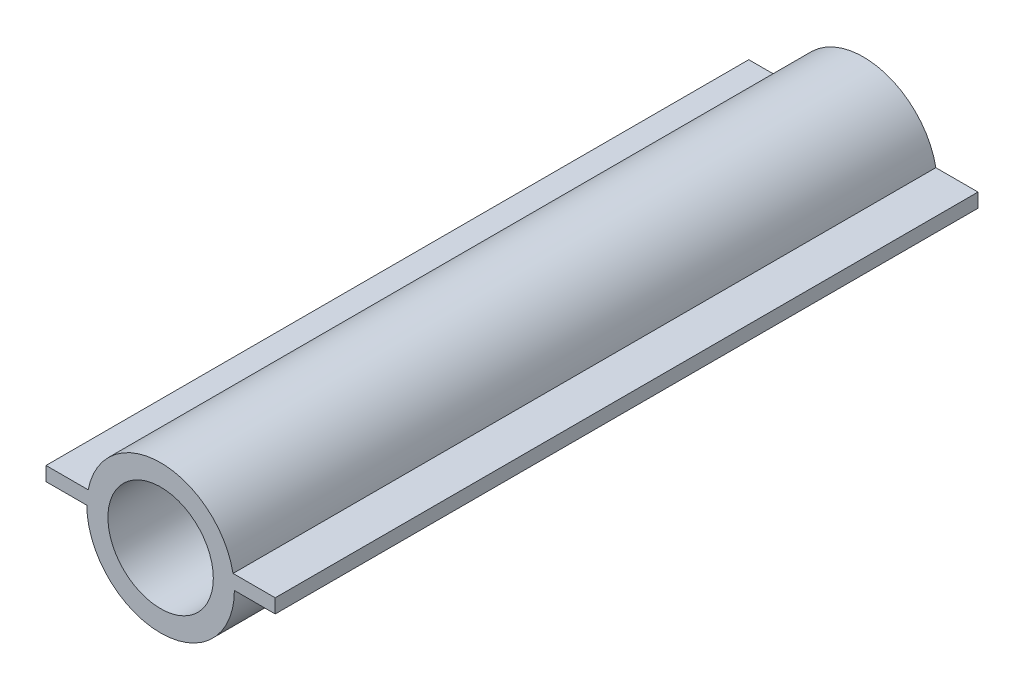
ISO-10303-21;
HEADER;
FILE_DESCRIPTION(('STEP AP214'),'2;1');
FILE_NAME('part.step','',(''),(''),'','','');
FILE_SCHEMA(('AUTOMOTIVE_DESIGN { 1 0 10303 214 1 1 1 1 }'));
ENDSEC;
DATA;
#1=APPLICATION_CONTEXT('core data for automotive mechanical design processes');
#2=APPLICATION_PROTOCOL_DEFINITION('international standard','automotive_design',2000,#1);
#3=PRODUCT_CONTEXT('',#1,'mechanical');
#4=PRODUCT('Part','Part','',(#3));
#5=PRODUCT_RELATED_PRODUCT_CATEGORY('part','',(#4));
#6=PRODUCT_DEFINITION_FORMATION('','',#4);
#7=PRODUCT_DEFINITION_CONTEXT('part definition',#1,'design');
#8=PRODUCT_DEFINITION('design','',#6,#7);
#9=PRODUCT_DEFINITION_SHAPE('','',#8);
#10=(LENGTH_UNIT() NAMED_UNIT(*) SI_UNIT(.MILLI.,.METRE.));
#11=(NAMED_UNIT(*) PLANE_ANGLE_UNIT() SI_UNIT($,.RADIAN.));
#12=(NAMED_UNIT(*) SI_UNIT($,.STERADIAN.) SOLID_ANGLE_UNIT());
#13=UNCERTAINTY_MEASURE_WITH_UNIT(LENGTH_MEASURE(1.E-05),#10,'distance_accuracy_value','');
#14=(GEOMETRIC_REPRESENTATION_CONTEXT(3) GLOBAL_UNCERTAINTY_ASSIGNED_CONTEXT((#13)) GLOBAL_UNIT_ASSIGNED_CONTEXT((#10,
#11,#12)) REPRESENTATION_CONTEXT('',''));
#15=CARTESIAN_POINT('',(0.,0.,0.));
#16=DIRECTION('',(0.,0.,1.));
#17=DIRECTION('',(1.,0.,0.));
#18=AXIS2_PLACEMENT_3D('',#15,#16,#17);
#19=CARTESIAN_POINT('',(0.,0.,50.));
#20=DIRECTION('',(0.,0.,1.));
#21=DIRECTION('',(1.,0.,0.));
#22=AXIS2_PLACEMENT_3D('',#19,#20,#21);
#23=PLANE('',#22);
#24=DIRECTION('',(0.,-1.,0.));
#25=VECTOR('',#24,1.);
#26=CARTESIAN_POINT('',(-8.15388203202208,1.,50.));
#27=LINE('',#26,#25);
#28=CARTESIAN_POINT('',(-8.15388203202208,1.,50.));
#29=VERTEX_POINT('',#28);
#30=CARTESIAN_POINT('',(-8.15388203202208,0.,50.));
#31=VERTEX_POINT('',#30);
#32=EDGE_CURVE('E145',#29,#31,#27,.T.);
#33=ORIENTED_EDGE('',*,*,#32,.T.);
#34=DIRECTION('',(1.,0.,0.));
#35=VECTOR('',#34,1.);
#36=CARTESIAN_POINT('',(-8.15388203202208,0.,50.));
#37=LINE('',#36,#35);
#38=CARTESIAN_POINT('',(-5.25,0.,50.));
#39=VERTEX_POINT('',#38);
#40=EDGE_CURVE('E93',#31,#39,#37,.T.);
#41=ORIENTED_EDGE('',*,*,#40,.T.);
#42=CARTESIAN_POINT('',(0.,0.,50.));
#43=DIRECTION('',(0.,0.,1.));
#44=DIRECTION('',(1.,0.,0.));
#45=AXIS2_PLACEMENT_3D('',#42,#43,#44);
#46=CIRCLE('',#45,5.25);
#47=CARTESIAN_POINT('',(5.25,0.,50.));
#48=VERTEX_POINT('',#47);
#49=EDGE_CURVE('E160',#39,#48,#46,.T.);
#50=ORIENTED_EDGE('',*,*,#49,.T.);
#51=DIRECTION('',(1.,0.,0.));
#52=VECTOR('',#51,1.);
#53=CARTESIAN_POINT('',(8.15388203202208,0.,50.));
#54=LINE('',#53,#52);
#55=CARTESIAN_POINT('',(8.15388203202208,0.,50.));
#56=VERTEX_POINT('',#55);
#57=EDGE_CURVE('E173',#48,#56,#54,.T.);
#58=ORIENTED_EDGE('',*,*,#57,.T.);
#59=DIRECTION('',(0.,1.,0.));
#60=VECTOR('',#59,1.);
#61=CARTESIAN_POINT('',(8.15388203202208,1.,50.));
#62=LINE('',#61,#60);
#63=CARTESIAN_POINT('',(8.15388203202208,1.,50.));
#64=VERTEX_POINT('',#63);
#65=EDGE_CURVE('E112',#56,#64,#62,.T.);
#66=ORIENTED_EDGE('',*,*,#65,.T.);
#67=DIRECTION('',(-1.,0.,0.));
#68=VECTOR('',#67,1.);
#69=CARTESIAN_POINT('',(5.15388203202208,1.,50.));
#70=LINE('',#69,#68);
#71=CARTESIAN_POINT('',(5.15388203202208,1.,50.));
#72=VERTEX_POINT('',#71);
#73=EDGE_CURVE('E106',#64,#72,#70,.T.);
#74=ORIENTED_EDGE('',*,*,#73,.T.);
#75=CARTESIAN_POINT('',(0.,0.,50.));
#76=DIRECTION('',(0.,0.,1.));
#77=DIRECTION('',(1.,0.,0.));
#78=AXIS2_PLACEMENT_3D('',#75,#76,#77);
#79=CIRCLE('',#78,5.25);
#80=CARTESIAN_POINT('',(-5.15388203202208,1.,50.));
#81=VERTEX_POINT('',#80);
#82=EDGE_CURVE('E110',#72,#81,#79,.T.);
#83=ORIENTED_EDGE('',*,*,#82,.T.);
#84=DIRECTION('',(-1.,0.,0.));
#85=VECTOR('',#84,1.);
#86=CARTESIAN_POINT('',(-5.15388203202208,1.,50.));
#87=LINE('',#86,#85);
#88=EDGE_CURVE('E50',#81,#29,#87,.T.);
#89=ORIENTED_EDGE('',*,*,#88,.T.);
#90=EDGE_LOOP('',(#33,#41,#50,#58,#66,#74,#83,#89));
#91=FACE_BOUND('',#90,.T.);
#92=CARTESIAN_POINT('',(0.,0.,50.));
#93=DIRECTION('',(0.,0.,1.));
#94=DIRECTION('',(1.,0.,0.));
#95=AXIS2_PLACEMENT_3D('',#92,#93,#94);
#96=CIRCLE('',#95,3.75);
#97=CARTESIAN_POINT('',(3.75,0.,50.));
#98=VERTEX_POINT('',#97);
#99=EDGE_CURVE('E134',#98,#98,#96,.T.);
#100=ORIENTED_EDGE('',*,*,#99,.F.);
#101=EDGE_LOOP('',(#100));
#102=FACE_BOUND('',#101,.T.);
#103=ADVANCED_FACE('F33',(#91,#102),#23,.T.);
#104=CARTESIAN_POINT('',(0.,0.,0.));
#105=DIRECTION('',(0.,0.,1.));
#106=DIRECTION('',(1.,0.,0.));
#107=AXIS2_PLACEMENT_3D('',#104,#105,#106);
#108=PLANE('',#107);
#109=DIRECTION('',(0.,-1.,0.));
#110=VECTOR('',#109,1.);
#111=CARTESIAN_POINT('',(-8.15388203202208,1.,0.));
#112=LINE('',#111,#110);
#113=CARTESIAN_POINT('',(-8.15388203202208,1.,0.));
#114=VERTEX_POINT('',#113);
#115=CARTESIAN_POINT('',(-8.15388203202208,0.,0.));
#116=VERTEX_POINT('',#115);
#117=EDGE_CURVE('E130',#114,#116,#112,.T.);
#118=ORIENTED_EDGE('',*,*,#117,.F.);
#119=DIRECTION('',(-1.,0.,0.));
#120=VECTOR('',#119,1.);
#121=CARTESIAN_POINT('',(-5.15388203202208,1.,0.));
#122=LINE('',#121,#120);
#123=CARTESIAN_POINT('',(-5.15388203202208,1.,0.));
#124=VERTEX_POINT('',#123);
#125=EDGE_CURVE('E85',#124,#114,#122,.T.);
#126=ORIENTED_EDGE('',*,*,#125,.F.);
#127=CARTESIAN_POINT('',(0.,0.,0.));
#128=DIRECTION('',(0.,0.,1.));
#129=DIRECTION('',(1.,0.,0.));
#130=AXIS2_PLACEMENT_3D('',#127,#128,#129);
#131=CIRCLE('',#130,5.25);
#132=CARTESIAN_POINT('',(5.15388203202208,1.,0.));
#133=VERTEX_POINT('',#132);
#134=EDGE_CURVE('E79',#133,#124,#131,.T.);
#135=ORIENTED_EDGE('',*,*,#134,.F.);
#136=DIRECTION('',(-1.,0.,0.));
#137=VECTOR('',#136,1.);
#138=CARTESIAN_POINT('',(5.15388203202208,1.,0.));
#139=LINE('',#138,#137);
#140=CARTESIAN_POINT('',(8.15388203202208,1.,0.));
#141=VERTEX_POINT('',#140);
#142=EDGE_CURVE('E120',#141,#133,#139,.T.);
#143=ORIENTED_EDGE('',*,*,#142,.F.);
#144=DIRECTION('',(0.,1.,0.));
#145=VECTOR('',#144,1.);
#146=CARTESIAN_POINT('',(8.15388203202208,1.,0.));
#147=LINE('',#146,#145);
#148=CARTESIAN_POINT('',(8.15388203202208,0.,0.));
#149=VERTEX_POINT('',#148);
#150=EDGE_CURVE('E140',#149,#141,#147,.T.);
#151=ORIENTED_EDGE('',*,*,#150,.F.);
#152=DIRECTION('',(1.,0.,0.));
#153=VECTOR('',#152,1.);
#154=CARTESIAN_POINT('',(8.15388203202208,0.,0.));
#155=LINE('',#154,#153);
#156=CARTESIAN_POINT('',(5.25,0.,0.));
#157=VERTEX_POINT('',#156);
#158=EDGE_CURVE('E138',#157,#149,#155,.T.);
#159=ORIENTED_EDGE('',*,*,#158,.F.);
#160=CARTESIAN_POINT('',(0.,0.,0.));
#161=DIRECTION('',(0.,0.,1.));
#162=DIRECTION('',(1.,0.,0.));
#163=AXIS2_PLACEMENT_3D('',#160,#161,#162);
#164=CIRCLE('',#163,5.25);
#165=CARTESIAN_POINT('',(-5.25,0.,0.));
#166=VERTEX_POINT('',#165);
#167=EDGE_CURVE('E136',#166,#157,#164,.T.);
#168=ORIENTED_EDGE('',*,*,#167,.F.);
#169=DIRECTION('',(1.,0.,0.));
#170=VECTOR('',#169,1.);
#171=CARTESIAN_POINT('',(-8.15388203202208,0.,0.));
#172=LINE('',#171,#170);
#173=EDGE_CURVE('E133',#116,#166,#172,.T.);
#174=ORIENTED_EDGE('',*,*,#173,.F.);
#175=EDGE_LOOP('',(#118,#126,#135,#143,#151,#159,#168,#174));
#176=FACE_BOUND('',#175,.T.);
#177=CARTESIAN_POINT('',(0.,0.,0.));
#178=DIRECTION('',(0.,0.,1.));
#179=DIRECTION('',(1.,0.,0.));
#180=AXIS2_PLACEMENT_3D('',#177,#178,#179);
#181=CIRCLE('',#180,3.75);
#182=CARTESIAN_POINT('',(3.75,0.,0.));
#183=VERTEX_POINT('',#182);
#184=EDGE_CURVE('E179',#183,#183,#181,.T.);
#185=ORIENTED_EDGE('',*,*,#184,.T.);
#186=EDGE_LOOP('',(#185));
#187=FACE_BOUND('',#186,.T.);
#188=ADVANCED_FACE('F164',(#176,#187),#108,.F.);
#189=CARTESIAN_POINT('',(-8.15388203202208,1.,50.));
#190=DIRECTION('',(1.,0.,0.));
#191=DIRECTION('',(0.,0.,-1.));
#192=AXIS2_PLACEMENT_3D('',#189,#190,#191);
#193=PLANE('',#192);
#194=ORIENTED_EDGE('',*,*,#117,.T.);
#195=DIRECTION('',(0.,0.,-1.));
#196=VECTOR('',#195,1.);
#197=CARTESIAN_POINT('',(-8.15388203202208,0.,50.));
#198=LINE('',#197,#196);
#199=EDGE_CURVE('E11',#31,#116,#198,.T.);
#200=ORIENTED_EDGE('',*,*,#199,.F.);
#201=ORIENTED_EDGE('',*,*,#32,.F.);
#202=DIRECTION('',(0.,0.,-1.));
#203=VECTOR('',#202,1.);
#204=CARTESIAN_POINT('',(-8.15388203202208,1.,50.));
#205=LINE('',#204,#203);
#206=EDGE_CURVE('E126',#29,#114,#205,.T.);
#207=ORIENTED_EDGE('',*,*,#206,.T.);
#208=EDGE_LOOP('',(#194,#200,#201,#207));
#209=FACE_BOUND('',#208,.T.);
#210=ADVANCED_FACE('F35',(#209),#193,.F.);
#211=CARTESIAN_POINT('',(-8.15388203202208,0.,50.));
#212=DIRECTION('',(0.,1.,0.));
#213=DIRECTION('',(0.,0.,1.));
#214=AXIS2_PLACEMENT_3D('',#211,#212,#213);
#215=PLANE('',#214);
#216=ORIENTED_EDGE('',*,*,#173,.T.);
#217=DIRECTION('',(0.,0.,-1.));
#218=VECTOR('',#217,1.);
#219=CARTESIAN_POINT('',(-5.25,0.,50.));
#220=LINE('',#219,#218);
#221=EDGE_CURVE('E42',#39,#166,#220,.T.);
#222=ORIENTED_EDGE('',*,*,#221,.F.);
#223=ORIENTED_EDGE('',*,*,#40,.F.);
#224=ORIENTED_EDGE('',*,*,#199,.T.);
#225=EDGE_LOOP('',(#216,#222,#223,#224));
#226=FACE_BOUND('',#225,.T.);
#227=ADVANCED_FACE('F207',(#226),#215,.F.);
#228=CARTESIAN_POINT('',(0.,0.,50.));
#229=DIRECTION('',(0.,0.,-1.));
#230=DIRECTION('',(-1.,0.,0.));
#231=AXIS2_PLACEMENT_3D('',#228,#229,#230);
#232=CYLINDRICAL_SURFACE('',#231,5.25);
#233=ORIENTED_EDGE('',*,*,#167,.T.);
#234=DIRECTION('',(0.,0.,-1.));
#235=VECTOR('',#234,1.);
#236=CARTESIAN_POINT('',(5.25,0.,50.));
#237=LINE('',#236,#235);
#238=EDGE_CURVE('E152',#48,#157,#237,.T.);
#239=ORIENTED_EDGE('',*,*,#238,.F.);
#240=ORIENTED_EDGE('',*,*,#49,.F.);
#241=ORIENTED_EDGE('',*,*,#221,.T.);
#242=EDGE_LOOP('',(#233,#239,#240,#241));
#243=FACE_BOUND('',#242,.T.);
#244=ADVANCED_FACE('F158',(#243),#232,.T.);
#245=CARTESIAN_POINT('',(8.15388203202208,0.,50.));
#246=DIRECTION('',(0.,1.,0.));
#247=DIRECTION('',(0.,0.,1.));
#248=AXIS2_PLACEMENT_3D('',#245,#246,#247);
#249=PLANE('',#248);
#250=ORIENTED_EDGE('',*,*,#158,.T.);
#251=DIRECTION('',(0.,0.,-1.));
#252=VECTOR('',#251,1.);
#253=CARTESIAN_POINT('',(8.15388203202208,0.,50.));
#254=LINE('',#253,#252);
#255=EDGE_CURVE('E149',#56,#149,#254,.T.);
#256=ORIENTED_EDGE('',*,*,#255,.F.);
#257=ORIENTED_EDGE('',*,*,#57,.F.);
#258=ORIENTED_EDGE('',*,*,#238,.T.);
#259=EDGE_LOOP('',(#250,#256,#257,#258));
#260=FACE_BOUND('',#259,.T.);
#261=ADVANCED_FACE('F169',(#260),#249,.F.);
#262=CARTESIAN_POINT('',(8.15388203202208,1.,50.));
#263=DIRECTION('',(-1.,0.,0.));
#264=DIRECTION('',(0.,0.,1.));
#265=AXIS2_PLACEMENT_3D('',#262,#263,#264);
#266=PLANE('',#265);
#267=ORIENTED_EDGE('',*,*,#150,.T.);
#268=DIRECTION('',(0.,0.,-1.));
#269=VECTOR('',#268,1.);
#270=CARTESIAN_POINT('',(8.15388203202208,1.,50.));
#271=LINE('',#270,#269);
#272=EDGE_CURVE('E121',#64,#141,#271,.T.);
#273=ORIENTED_EDGE('',*,*,#272,.F.);
#274=ORIENTED_EDGE('',*,*,#65,.F.);
#275=ORIENTED_EDGE('',*,*,#255,.T.);
#276=EDGE_LOOP('',(#267,#273,#274,#275));
#277=FACE_BOUND('',#276,.T.);
#278=ADVANCED_FACE('F172',(#277),#266,.F.);
#279=CARTESIAN_POINT('',(5.15388203202208,1.,50.));
#280=DIRECTION('',(0.,-1.,0.));
#281=DIRECTION('',(0.,0.,-1.));
#282=AXIS2_PLACEMENT_3D('',#279,#280,#281);
#283=PLANE('',#282);
#284=ORIENTED_EDGE('',*,*,#142,.T.);
#285=DIRECTION('',(0.,0.,-1.));
#286=VECTOR('',#285,1.);
#287=CARTESIAN_POINT('',(5.15388203202208,1.,50.));
#288=LINE('',#287,#286);
#289=EDGE_CURVE('E117',#72,#133,#288,.T.);
#290=ORIENTED_EDGE('',*,*,#289,.F.);
#291=ORIENTED_EDGE('',*,*,#73,.F.);
#292=ORIENTED_EDGE('',*,*,#272,.T.);
#293=EDGE_LOOP('',(#284,#290,#291,#292));
#294=FACE_BOUND('',#293,.T.);
#295=ADVANCED_FACE('F118',(#294),#283,.F.);
#296=CARTESIAN_POINT('',(0.,0.,50.));
#297=DIRECTION('',(0.,0.,-1.));
#298=DIRECTION('',(-1.,0.,0.));
#299=AXIS2_PLACEMENT_3D('',#296,#297,#298);
#300=CYLINDRICAL_SURFACE('',#299,5.25);
#301=ORIENTED_EDGE('',*,*,#134,.T.);
#302=DIRECTION('',(0.,0.,-1.));
#303=VECTOR('',#302,1.);
#304=CARTESIAN_POINT('',(-5.15388203202208,1.,50.));
#305=LINE('',#304,#303);
#306=EDGE_CURVE('E122',#81,#124,#305,.T.);
#307=ORIENTED_EDGE('',*,*,#306,.F.);
#308=ORIENTED_EDGE('',*,*,#82,.F.);
#309=ORIENTED_EDGE('',*,*,#289,.T.);
#310=EDGE_LOOP('',(#301,#307,#308,#309));
#311=FACE_BOUND('',#310,.T.);
#312=ADVANCED_FACE('F124',(#311),#300,.T.);
#313=CARTESIAN_POINT('',(-5.15388203202208,1.,50.));
#314=DIRECTION('',(0.,-1.,0.));
#315=DIRECTION('',(0.,0.,-1.));
#316=AXIS2_PLACEMENT_3D('',#313,#314,#315);
#317=PLANE('',#316);
#318=ORIENTED_EDGE('',*,*,#125,.T.);
#319=ORIENTED_EDGE('',*,*,#206,.F.);
#320=ORIENTED_EDGE('',*,*,#88,.F.);
#321=ORIENTED_EDGE('',*,*,#306,.T.);
#322=EDGE_LOOP('',(#318,#319,#320,#321));
#323=FACE_BOUND('',#322,.T.);
#324=ADVANCED_FACE('F195',(#323),#317,.F.);
#325=CARTESIAN_POINT('',(0.,0.,50.));
#326=DIRECTION('',(0.,0.,-1.));
#327=DIRECTION('',(-1.,0.,0.));
#328=AXIS2_PLACEMENT_3D('',#325,#326,#327);
#329=CYLINDRICAL_SURFACE('',#328,3.75);
#330=ORIENTED_EDGE('',*,*,#99,.T.);
#331=EDGE_LOOP('',(#330));
#332=FACE_BOUND('',#331,.T.);
#333=ORIENTED_EDGE('',*,*,#184,.F.);
#334=EDGE_LOOP('',(#333));
#335=FACE_BOUND('',#334,.T.);
#336=ADVANCED_FACE('F185',(#332,#335),#329,.F.);
#337=CLOSED_SHELL('',(#103,#188,#210,#227,#244,#261,#278,#295,#312,#324,#336));
#338=MANIFOLD_SOLID_BREP('B2',#337);
#339=ADVANCED_BREP_SHAPE_REPRESENTATION('',(#18,#338),#14);
#340=SHAPE_DEFINITION_REPRESENTATION(#9,#339);
ENDSEC;
END-ISO-10303-21;
